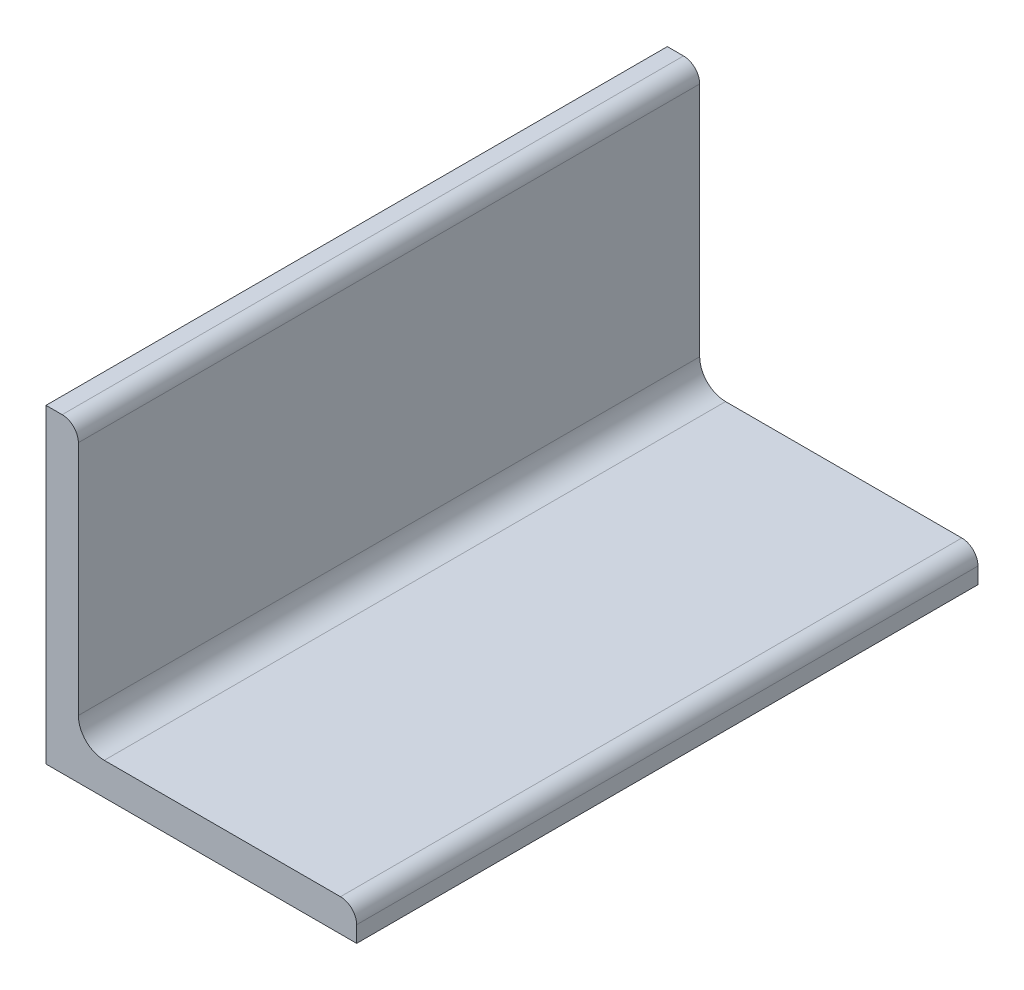
ISO-10303-21;
HEADER;
FILE_DESCRIPTION(('STEP AP214'),'2;1');
FILE_NAME('part.step','',(''),(''),'','','');
FILE_SCHEMA(('AUTOMOTIVE_DESIGN { 1 0 10303 214 1 1 1 1 }'));
ENDSEC;
DATA;
#1=APPLICATION_CONTEXT('core data for automotive mechanical design processes');
#2=APPLICATION_PROTOCOL_DEFINITION('international standard','automotive_design',2000,#1);
#3=PRODUCT_CONTEXT('',#1,'mechanical');
#4=PRODUCT('Part','Part','',(#3));
#5=PRODUCT_RELATED_PRODUCT_CATEGORY('part','',(#4));
#6=PRODUCT_DEFINITION_FORMATION('','',#4);
#7=PRODUCT_DEFINITION_CONTEXT('part definition',#1,'design');
#8=PRODUCT_DEFINITION('design','',#6,#7);
#9=PRODUCT_DEFINITION_SHAPE('','',#8);
#10=(LENGTH_UNIT() NAMED_UNIT(*) SI_UNIT(.MILLI.,.METRE.));
#11=(NAMED_UNIT(*) PLANE_ANGLE_UNIT() SI_UNIT($,.RADIAN.));
#12=(NAMED_UNIT(*) SI_UNIT($,.STERADIAN.) SOLID_ANGLE_UNIT());
#13=UNCERTAINTY_MEASURE_WITH_UNIT(LENGTH_MEASURE(1.E-05),#10,'distance_accuracy_value','');
#14=(GEOMETRIC_REPRESENTATION_CONTEXT(3) GLOBAL_UNCERTAINTY_ASSIGNED_CONTEXT((#13)) GLOBAL_UNIT_ASSIGNED_CONTEXT((#10,
#11,#12)) REPRESENTATION_CONTEXT('',''));
#15=CARTESIAN_POINT('',(0.,0.,0.));
#16=DIRECTION('',(0.,0.,1.));
#17=DIRECTION('',(1.,0.,0.));
#18=AXIS2_PLACEMENT_3D('',#15,#16,#17);
#19=CARTESIAN_POINT('',(0.425014111727251,152.925428131371,304.8));
#20=DIRECTION('',(1.,0.,0.));
#21=DIRECTION('',(0.,0.,-1.));
#22=AXIS2_PLACEMENT_3D('',#19,#20,#21);
#23=PLANE('',#22);
#24=DIRECTION('',(0.,-1.,0.));
#25=VECTOR('',#24,1.);
#26=CARTESIAN_POINT('',(0.425014111727251,152.925428131371,0.));
#27=LINE('',#26,#25);
#28=CARTESIAN_POINT('',(0.425014111727251,152.925428131371,0.));
#29=VERTEX_POINT('',#28);
#30=CARTESIAN_POINT('',(0.425014111727251,0.525428131371291,0.));
#31=VERTEX_POINT('',#30);
#32=EDGE_CURVE('E135',#29,#31,#27,.T.);
#33=ORIENTED_EDGE('',*,*,#32,.T.);
#34=DIRECTION('',(0.,0.,-1.));
#35=VECTOR('',#34,1.);
#36=CARTESIAN_POINT('',(0.425014111727251,0.525428131371291,304.8));
#37=LINE('',#36,#35);
#38=CARTESIAN_POINT('',(0.425014111727251,0.525428131371291,304.8));
#39=VERTEX_POINT('',#38);
#40=EDGE_CURVE('E11',#39,#31,#37,.T.);
#41=ORIENTED_EDGE('',*,*,#40,.F.);
#42=DIRECTION('',(0.,-1.,0.));
#43=VECTOR('',#42,1.);
#44=CARTESIAN_POINT('',(0.425014111727251,152.925428131371,304.8));
#45=LINE('',#44,#43);
#46=CARTESIAN_POINT('',(0.425014111727251,152.925428131371,304.8));
#47=VERTEX_POINT('',#46);
#48=EDGE_CURVE('E151',#47,#39,#45,.T.);
#49=ORIENTED_EDGE('',*,*,#48,.F.);
#50=DIRECTION('',(0.,0.,-1.));
#51=VECTOR('',#50,1.);
#52=CARTESIAN_POINT('',(0.425014111727251,152.925428131371,304.8));
#53=LINE('',#52,#51);
#54=EDGE_CURVE('E131',#47,#29,#53,.T.);
#55=ORIENTED_EDGE('',*,*,#54,.T.);
#56=EDGE_LOOP('',(#33,#41,#49,#55));
#57=FACE_BOUND('',#56,.T.);
#58=ADVANCED_FACE('F33',(#57),#23,.F.);
#59=CARTESIAN_POINT('',(0.425014111727251,0.525428131371291,304.8));
#60=DIRECTION('',(0.,1.,0.));
#61=DIRECTION('',(0.,0.,1.));
#62=AXIS2_PLACEMENT_3D('',#59,#60,#61);
#63=PLANE('',#62);
#64=DIRECTION('',(1.,0.,0.));
#65=VECTOR('',#64,1.);
#66=CARTESIAN_POINT('',(0.425014111727251,0.525428131371291,0.));
#67=LINE('',#66,#65);
#68=CARTESIAN_POINT('',(152.825014111727,0.525428131371291,0.));
#69=VERTEX_POINT('',#68);
#70=EDGE_CURVE('E138',#31,#69,#67,.T.);
#71=ORIENTED_EDGE('',*,*,#70,.T.);
#72=DIRECTION('',(0.,0.,-1.));
#73=VECTOR('',#72,1.);
#74=CARTESIAN_POINT('',(152.825014111727,0.525428131371291,304.8));
#75=LINE('',#74,#73);
#76=CARTESIAN_POINT('',(152.825014111727,0.525428131371291,304.8));
#77=VERTEX_POINT('',#76);
#78=EDGE_CURVE('E41',#77,#69,#75,.T.);
#79=ORIENTED_EDGE('',*,*,#78,.F.);
#80=DIRECTION('',(1.,0.,0.));
#81=VECTOR('',#80,1.);
#82=CARTESIAN_POINT('',(0.425014111727251,0.525428131371291,304.8));
#83=LINE('',#82,#81);
#84=EDGE_CURVE('E95',#39,#77,#83,.T.);
#85=ORIENTED_EDGE('',*,*,#84,.F.);
#86=ORIENTED_EDGE('',*,*,#40,.T.);
#87=EDGE_LOOP('',(#71,#79,#85,#86));
#88=FACE_BOUND('',#87,.T.);
#89=ADVANCED_FACE('F194',(#88),#63,.F.);
#90=CARTESIAN_POINT('',(152.825014111727,0.525428131371291,304.8));
#91=DIRECTION('',(-1.,0.,0.));
#92=DIRECTION('',(0.,0.,1.));
#93=AXIS2_PLACEMENT_3D('',#90,#91,#92);
#94=PLANE('',#93);
#95=DIRECTION('',(0.,1.,0.));
#96=VECTOR('',#95,1.);
#97=CARTESIAN_POINT('',(152.825014111727,0.525428131371291,0.));
#98=LINE('',#97,#96);
#99=CARTESIAN_POINT('',(152.825014111727,8.46292813137129,0.));
#100=VERTEX_POINT('',#99);
#101=EDGE_CURVE('E140',#69,#100,#98,.T.);
#102=ORIENTED_EDGE('',*,*,#101,.T.);
#103=DIRECTION('',(0.,0.,-1.));
#104=VECTOR('',#103,1.);
#105=CARTESIAN_POINT('',(152.825014111727,8.46292813137129,304.8));
#106=LINE('',#105,#104);
#107=CARTESIAN_POINT('',(152.825014111727,8.46292813137129,304.8));
#108=VERTEX_POINT('',#107);
#109=EDGE_CURVE('E161',#108,#100,#106,.T.);
#110=ORIENTED_EDGE('',*,*,#109,.F.);
#111=DIRECTION('',(0.,1.,0.));
#112=VECTOR('',#111,1.);
#113=CARTESIAN_POINT('',(152.825014111727,0.525428131371291,304.8));
#114=LINE('',#113,#112);
#115=EDGE_CURVE('E169',#77,#108,#114,.T.);
#116=ORIENTED_EDGE('',*,*,#115,.F.);
#117=ORIENTED_EDGE('',*,*,#78,.T.);
#118=EDGE_LOOP('',(#102,#110,#116,#117));
#119=FACE_BOUND('',#118,.T.);
#120=ADVANCED_FACE('F167',(#119),#94,.F.);
#121=CARTESIAN_POINT('',(144.887514111727,8.46292813137129,304.8));
#122=DIRECTION('',(0.,0.,-1.));
#123=DIRECTION('',(-1.,0.,0.));
#124=AXIS2_PLACEMENT_3D('',#121,#122,#123);
#125=CYLINDRICAL_SURFACE('',#124,7.93750000000001);
#126=CARTESIAN_POINT('',(144.887514111727,8.46292813137129,0.));
#127=DIRECTION('',(0.,0.,1.));
#128=DIRECTION('',(1.,0.,0.));
#129=AXIS2_PLACEMENT_3D('',#126,#127,#128);
#130=CIRCLE('',#129,7.93750000000001);
#131=CARTESIAN_POINT('',(144.887514111727,16.4004281313713,0.));
#132=VERTEX_POINT('',#131);
#133=EDGE_CURVE('E142',#100,#132,#130,.T.);
#134=ORIENTED_EDGE('',*,*,#133,.T.);
#135=DIRECTION('',(0.,0.,-1.));
#136=VECTOR('',#135,1.);
#137=CARTESIAN_POINT('',(144.887514111727,16.4004281313713,304.8));
#138=LINE('',#137,#136);
#139=CARTESIAN_POINT('',(144.887514111727,16.4004281313713,304.8));
#140=VERTEX_POINT('',#139);
#141=EDGE_CURVE('E158',#140,#132,#138,.T.);
#142=ORIENTED_EDGE('',*,*,#141,.F.);
#143=CARTESIAN_POINT('',(144.887514111727,8.46292813137129,304.8));
#144=DIRECTION('',(0.,0.,1.));
#145=DIRECTION('',(1.,0.,0.));
#146=AXIS2_PLACEMENT_3D('',#143,#144,#145);
#147=CIRCLE('',#146,7.93750000000001);
#148=EDGE_CURVE('E185',#108,#140,#147,.T.);
#149=ORIENTED_EDGE('',*,*,#148,.F.);
#150=ORIENTED_EDGE('',*,*,#109,.T.);
#151=EDGE_LOOP('',(#134,#142,#149,#150));
#152=FACE_BOUND('',#151,.T.);
#153=ADVANCED_FACE('F178',(#152),#125,.T.);
#154=CARTESIAN_POINT('',(144.887514111727,16.4004281313713,304.8));
#155=DIRECTION('',(0.,-1.,0.));
#156=DIRECTION('',(0.,0.,-1.));
#157=AXIS2_PLACEMENT_3D('',#154,#155,#156);
#158=PLANE('',#157);
#159=DIRECTION('',(-1.,0.,0.));
#160=VECTOR('',#159,1.);
#161=CARTESIAN_POINT('',(144.887514111727,16.4004281313713,0.));
#162=LINE('',#161,#160);
#163=CARTESIAN_POINT('',(29.0000141117272,16.4004281313713,0.));
#164=VERTEX_POINT('',#163);
#165=EDGE_CURVE('E144',#132,#164,#162,.T.);
#166=ORIENTED_EDGE('',*,*,#165,.T.);
#167=DIRECTION('',(0.,0.,-1.));
#168=VECTOR('',#167,1.);
#169=CARTESIAN_POINT('',(29.0000141117272,16.4004281313713,304.8));
#170=LINE('',#169,#168);
#171=CARTESIAN_POINT('',(29.0000141117272,16.4004281313713,304.8));
#172=VERTEX_POINT('',#171);
#173=EDGE_CURVE('E155',#172,#164,#170,.T.);
#174=ORIENTED_EDGE('',*,*,#173,.F.);
#175=DIRECTION('',(-1.,0.,0.));
#176=VECTOR('',#175,1.);
#177=CARTESIAN_POINT('',(144.887514111727,16.4004281313713,304.8));
#178=LINE('',#177,#176);
#179=EDGE_CURVE('E184',#140,#172,#178,.T.);
#180=ORIENTED_EDGE('',*,*,#179,.F.);
#181=ORIENTED_EDGE('',*,*,#141,.T.);
#182=EDGE_LOOP('',(#166,#174,#180,#181));
#183=FACE_BOUND('',#182,.T.);
#184=ADVANCED_FACE('F182',(#183),#158,.F.);
#185=CARTESIAN_POINT('',(29.0000141117272,29.1004281313713,304.8));
#186=DIRECTION('',(0.,0.,-1.));
#187=DIRECTION('',(-1.,0.,0.));
#188=AXIS2_PLACEMENT_3D('',#185,#186,#187);
#189=CYLINDRICAL_SURFACE('',#188,12.7);
#190=CARTESIAN_POINT('',(29.0000141117272,29.1004281313713,0.));
#191=DIRECTION('',(0.,0.,-1.));
#192=DIRECTION('',(1.,0.,0.));
#193=AXIS2_PLACEMENT_3D('',#190,#191,#192);
#194=CIRCLE('',#193,12.7);
#195=CARTESIAN_POINT('',(16.3000141117272,29.1004281313713,0.));
#196=VERTEX_POINT('',#195);
#197=EDGE_CURVE('E146',#164,#196,#194,.T.);
#198=ORIENTED_EDGE('',*,*,#197,.T.);
#199=DIRECTION('',(0.,0.,-1.));
#200=VECTOR('',#199,1.);
#201=CARTESIAN_POINT('',(16.3000141117272,29.1004281313713,304.8));
#202=LINE('',#201,#200);
#203=CARTESIAN_POINT('',(16.3000141117272,29.1004281313713,304.8));
#204=VERTEX_POINT('',#203);
#205=EDGE_CURVE('E126',#204,#196,#202,.T.);
#206=ORIENTED_EDGE('',*,*,#205,.F.);
#207=CARTESIAN_POINT('',(29.0000141117272,29.1004281313713,304.8));
#208=DIRECTION('',(0.,0.,-1.));
#209=DIRECTION('',(1.,0.,0.));
#210=AXIS2_PLACEMENT_3D('',#207,#208,#209);
#211=CIRCLE('',#210,12.7);
#212=EDGE_CURVE('E117',#172,#204,#211,.T.);
#213=ORIENTED_EDGE('',*,*,#212,.F.);
#214=ORIENTED_EDGE('',*,*,#173,.T.);
#215=EDGE_LOOP('',(#198,#206,#213,#214));
#216=FACE_BOUND('',#215,.T.);
#217=ADVANCED_FACE('F206',(#216),#189,.F.);
#218=CARTESIAN_POINT('',(16.3000141117273,29.1004281313713,304.8));
#219=DIRECTION('',(-1.,0.,0.));
#220=DIRECTION('',(0.,0.,1.));
#221=AXIS2_PLACEMENT_3D('',#218,#219,#220);
#222=PLANE('',#221);
#223=DIRECTION('',(0.,1.,0.));
#224=VECTOR('',#223,1.);
#225=CARTESIAN_POINT('',(16.3000141117273,29.1004281313713,0.));
#226=LINE('',#225,#224);
#227=CARTESIAN_POINT('',(16.3000141117273,144.987928131371,0.));
#228=VERTEX_POINT('',#227);
#229=EDGE_CURVE('E125',#196,#228,#226,.T.);
#230=ORIENTED_EDGE('',*,*,#229,.T.);
#231=DIRECTION('',(0.,0.,-1.));
#232=VECTOR('',#231,1.);
#233=CARTESIAN_POINT('',(16.3000141117273,144.987928131371,304.8));
#234=LINE('',#233,#232);
#235=CARTESIAN_POINT('',(16.3000141117273,144.987928131371,304.8));
#236=VERTEX_POINT('',#235);
#237=EDGE_CURVE('E122',#236,#228,#234,.T.);
#238=ORIENTED_EDGE('',*,*,#237,.F.);
#239=DIRECTION('',(0.,1.,0.));
#240=VECTOR('',#239,1.);
#241=CARTESIAN_POINT('',(16.3000141117273,29.1004281313713,304.8));
#242=LINE('',#241,#240);
#243=EDGE_CURVE('E111',#204,#236,#242,.T.);
#244=ORIENTED_EDGE('',*,*,#243,.F.);
#245=ORIENTED_EDGE('',*,*,#205,.T.);
#246=EDGE_LOOP('',(#230,#238,#244,#245));
#247=FACE_BOUND('',#246,.T.);
#248=ADVANCED_FACE('F123',(#247),#222,.F.);
#249=CARTESIAN_POINT('',(8.36251411172725,144.987928131371,304.8));
#250=DIRECTION('',(0.,0.,-1.));
#251=DIRECTION('',(-1.,0.,0.));
#252=AXIS2_PLACEMENT_3D('',#249,#250,#251);
#253=CYLINDRICAL_SURFACE('',#252,7.93749999999999);
#254=CARTESIAN_POINT('',(8.36251411172725,144.987928131371,0.));
#255=DIRECTION('',(0.,0.,1.));
#256=DIRECTION('',(1.,0.,0.));
#257=AXIS2_PLACEMENT_3D('',#254,#255,#256);
#258=CIRCLE('',#257,7.93749999999999);
#259=CARTESIAN_POINT('',(8.36251411172725,152.925428131371,0.));
#260=VERTEX_POINT('',#259);
#261=EDGE_CURVE('E81',#228,#260,#258,.T.);
#262=ORIENTED_EDGE('',*,*,#261,.T.);
#263=DIRECTION('',(0.,0.,-1.));
#264=VECTOR('',#263,1.);
#265=CARTESIAN_POINT('',(8.36251411172725,152.925428131371,304.8));
#266=LINE('',#265,#264);
#267=CARTESIAN_POINT('',(8.36251411172725,152.925428131371,304.8));
#268=VERTEX_POINT('',#267);
#269=EDGE_CURVE('E127',#268,#260,#266,.T.);
#270=ORIENTED_EDGE('',*,*,#269,.F.);
#271=CARTESIAN_POINT('',(8.36251411172725,144.987928131371,304.8));
#272=DIRECTION('',(0.,0.,1.));
#273=DIRECTION('',(1.,0.,0.));
#274=AXIS2_PLACEMENT_3D('',#271,#272,#273);
#275=CIRCLE('',#274,7.93749999999999);
#276=EDGE_CURVE('E115',#236,#268,#275,.T.);
#277=ORIENTED_EDGE('',*,*,#276,.F.);
#278=ORIENTED_EDGE('',*,*,#237,.T.);
#279=EDGE_LOOP('',(#262,#270,#277,#278));
#280=FACE_BOUND('',#279,.T.);
#281=ADVANCED_FACE('F129',(#280),#253,.T.);
#282=CARTESIAN_POINT('',(8.36251411172725,152.925428131371,304.8));
#283=DIRECTION('',(0.,-1.,0.));
#284=DIRECTION('',(0.,0.,-1.));
#285=AXIS2_PLACEMENT_3D('',#282,#283,#284);
#286=PLANE('',#285);
#287=DIRECTION('',(-1.,0.,0.));
#288=VECTOR('',#287,1.);
#289=CARTESIAN_POINT('',(8.36251411172725,152.925428131371,0.));
#290=LINE('',#289,#288);
#291=EDGE_CURVE('E87',#260,#29,#290,.T.);
#292=ORIENTED_EDGE('',*,*,#291,.T.);
#293=ORIENTED_EDGE('',*,*,#54,.F.);
#294=DIRECTION('',(-1.,0.,0.));
#295=VECTOR('',#294,1.);
#296=CARTESIAN_POINT('',(8.36251411172725,152.925428131371,304.8));
#297=LINE('',#296,#295);
#298=EDGE_CURVE('E49',#268,#47,#297,.T.);
#299=ORIENTED_EDGE('',*,*,#298,.F.);
#300=ORIENTED_EDGE('',*,*,#269,.T.);
#301=EDGE_LOOP('',(#292,#293,#299,#300));
#302=FACE_BOUND('',#301,.T.);
#303=ADVANCED_FACE('F214',(#302),#286,.F.);
#304=CARTESIAN_POINT('',(144.887514111727,8.46292813137129,304.8));
#305=DIRECTION('',(0.,0.,1.));
#306=DIRECTION('',(1.,0.,0.));
#307=AXIS2_PLACEMENT_3D('',#304,#305,#306);
#308=PLANE('',#307);
#309=ORIENTED_EDGE('',*,*,#48,.T.);
#310=ORIENTED_EDGE('',*,*,#84,.T.);
#311=ORIENTED_EDGE('',*,*,#115,.T.);
#312=ORIENTED_EDGE('',*,*,#148,.T.);
#313=ORIENTED_EDGE('',*,*,#179,.T.);
#314=ORIENTED_EDGE('',*,*,#212,.T.);
#315=ORIENTED_EDGE('',*,*,#243,.T.);
#316=ORIENTED_EDGE('',*,*,#276,.T.);
#317=ORIENTED_EDGE('',*,*,#298,.T.);
#318=EDGE_LOOP('',(#309,#310,#311,#312,#313,#314,#315,#316,#317));
#319=FACE_BOUND('',#318,.T.);
#320=ADVANCED_FACE('F113',(#319),#308,.T.);
#321=CARTESIAN_POINT('',(144.887514111727,8.46292813137129,0.));
#322=DIRECTION('',(0.,0.,1.));
#323=DIRECTION('',(1.,0.,0.));
#324=AXIS2_PLACEMENT_3D('',#321,#322,#323);
#325=PLANE('',#324);
#326=ORIENTED_EDGE('',*,*,#32,.F.);
#327=ORIENTED_EDGE('',*,*,#291,.F.);
#328=ORIENTED_EDGE('',*,*,#261,.F.);
#329=ORIENTED_EDGE('',*,*,#229,.F.);
#330=ORIENTED_EDGE('',*,*,#197,.F.);
#331=ORIENTED_EDGE('',*,*,#165,.F.);
#332=ORIENTED_EDGE('',*,*,#133,.F.);
#333=ORIENTED_EDGE('',*,*,#101,.F.);
#334=ORIENTED_EDGE('',*,*,#70,.F.);
#335=EDGE_LOOP('',(#326,#327,#328,#329,#330,#331,#332,#333,#334));
#336=FACE_BOUND('',#335,.T.);
#337=ADVANCED_FACE('F173',(#336),#325,.F.);
#338=CLOSED_SHELL('',(#58,#89,#120,#153,#184,#217,#248,#281,#303,#320,#337));
#339=MANIFOLD_SOLID_BREP('B2',#338);
#340=ADVANCED_BREP_SHAPE_REPRESENTATION('',(#18,#339),#14);
#341=SHAPE_DEFINITION_REPRESENTATION(#9,#340);
ENDSEC;
END-ISO-10303-21;
